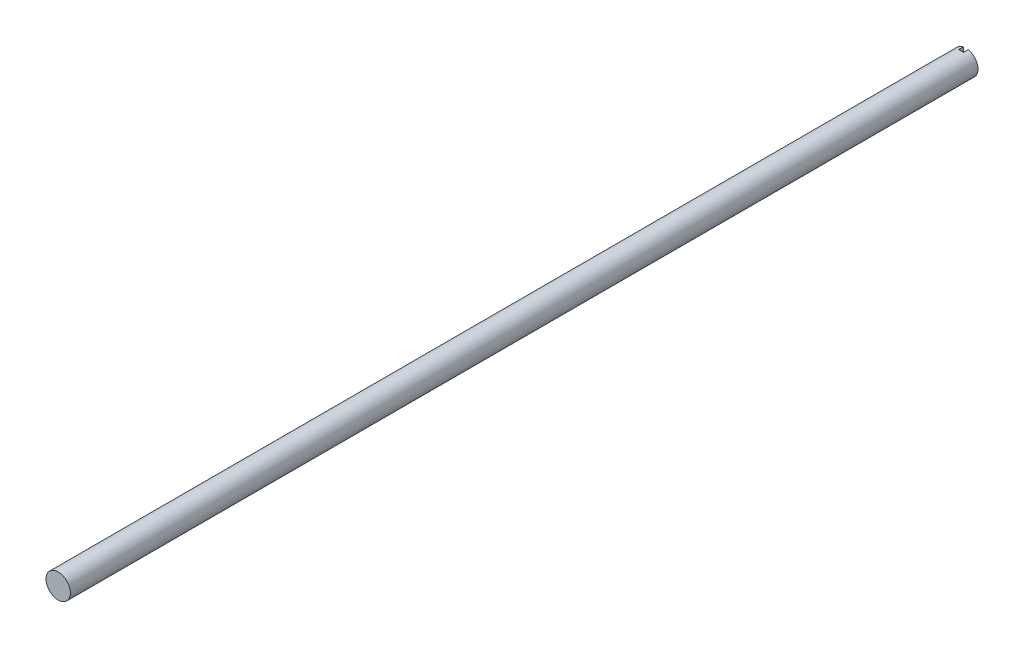
ISO-10303-21;
HEADER;
FILE_DESCRIPTION(('STEP AP214'),'2;1');
FILE_NAME('part.step','',(''),(''),'','','');
FILE_SCHEMA(('AUTOMOTIVE_DESIGN { 1 0 10303 214 1 1 1 1 }'));
ENDSEC;
DATA;
#1=APPLICATION_CONTEXT('core data for automotive mechanical design processes');
#2=APPLICATION_PROTOCOL_DEFINITION('international standard','automotive_design',2000,#1);
#3=PRODUCT_CONTEXT('',#1,'mechanical');
#4=PRODUCT('Part','Part','',(#3));
#5=PRODUCT_RELATED_PRODUCT_CATEGORY('part','',(#4));
#6=PRODUCT_DEFINITION_FORMATION('','',#4);
#7=PRODUCT_DEFINITION_CONTEXT('part definition',#1,'design');
#8=PRODUCT_DEFINITION('design','',#6,#7);
#9=PRODUCT_DEFINITION_SHAPE('','',#8);
#10=(LENGTH_UNIT() NAMED_UNIT(*) SI_UNIT(.MILLI.,.METRE.));
#11=(NAMED_UNIT(*) PLANE_ANGLE_UNIT() SI_UNIT($,.RADIAN.));
#12=(NAMED_UNIT(*) SI_UNIT($,.STERADIAN.) SOLID_ANGLE_UNIT());
#13=UNCERTAINTY_MEASURE_WITH_UNIT(LENGTH_MEASURE(1.E-05),#10,'distance_accuracy_value','');
#14=(GEOMETRIC_REPRESENTATION_CONTEXT(3) GLOBAL_UNCERTAINTY_ASSIGNED_CONTEXT((#13)) GLOBAL_UNIT_ASSIGNED_CONTEXT((#10,
#11,#12)) REPRESENTATION_CONTEXT('',''));
#15=CARTESIAN_POINT('',(0.,0.,0.));
#16=DIRECTION('',(0.,0.,1.));
#17=DIRECTION('',(1.,0.,0.));
#18=AXIS2_PLACEMENT_3D('',#15,#16,#17);
#19=CARTESIAN_POINT('',(0.,0.,0.));
#20=DIRECTION('',(0.,0.,1.));
#21=DIRECTION('',(1.,0.,0.));
#22=AXIS2_PLACEMENT_3D('',#19,#20,#21);
#23=PLANE('',#22);
#24=CARTESIAN_POINT('',(0.,0.,0.));
#25=DIRECTION('',(0.,0.,1.));
#26=DIRECTION('',(1.,0.,0.));
#27=AXIS2_PLACEMENT_3D('',#24,#25,#26);
#28=CIRCLE('',#27,2.5);
#29=CARTESIAN_POINT('',(-0.499999999999999,2.44948974278318,0.));
#30=VERTEX_POINT('',#29);
#31=CARTESIAN_POINT('',(-0.5,-2.44948974278318,0.));
#32=VERTEX_POINT('',#31);
#33=EDGE_CURVE('E44',#30,#32,#28,.T.);
#34=ORIENTED_EDGE('',*,*,#33,.F.);
#35=DIRECTION('',(0.,1.,0.));
#36=VECTOR('',#35,1.);
#37=CARTESIAN_POINT('',(-0.499999999999999,2.44948974278318,0.));
#38=LINE('',#37,#36);
#39=EDGE_CURVE('E74',#32,#30,#38,.T.);
#40=ORIENTED_EDGE('',*,*,#39,.F.);
#41=EDGE_LOOP('',(#34,#40));
#42=FACE_BOUND('',#41,.T.);
#43=ADVANCED_FACE('F35',(#42),#23,.F.);
#44=CARTESIAN_POINT('',(0.,0.,186.));
#45=DIRECTION('',(0.,0.,-1.));
#46=DIRECTION('',(-1.,0.,0.));
#47=AXIS2_PLACEMENT_3D('',#44,#45,#46);
#48=CYLINDRICAL_SURFACE('',#47,2.5);
#49=CARTESIAN_POINT('',(0.,0.,1.));
#50=DIRECTION('',(0.,0.,-1.));
#51=DIRECTION('',(-1.,0.,0.));
#52=AXIS2_PLACEMENT_3D('',#49,#50,#51);
#53=CIRCLE('',#52,2.5);
#54=CARTESIAN_POINT('',(-0.499999999999999,2.44948974278318,1.));
#55=VERTEX_POINT('',#54);
#56=CARTESIAN_POINT('',(0.499999999999999,2.44948974278318,1.));
#57=VERTEX_POINT('',#56);
#58=EDGE_CURVE('E94',#55,#57,#53,.T.);
#59=ORIENTED_EDGE('',*,*,#58,.F.);
#60=DIRECTION('',(0.,0.,-1.));
#61=VECTOR('',#60,1.);
#62=CARTESIAN_POINT('',(-0.499999999999999,2.44948974278318,1.));
#63=LINE('',#62,#61);
#64=EDGE_CURVE('E60',#55,#30,#63,.T.);
#65=ORIENTED_EDGE('',*,*,#64,.T.);
#66=ORIENTED_EDGE('',*,*,#33,.T.);
#67=DIRECTION('',(0.,0.,-1.));
#68=VECTOR('',#67,1.);
#69=CARTESIAN_POINT('',(-0.5,-2.44948974278318,1.));
#70=LINE('',#69,#68);
#71=CARTESIAN_POINT('',(-0.5,-2.44948974278318,1.));
#72=VERTEX_POINT('',#71);
#73=EDGE_CURVE('E88',#72,#32,#70,.T.);
#74=ORIENTED_EDGE('',*,*,#73,.F.);
#75=CARTESIAN_POINT('',(0.,0.,1.));
#76=DIRECTION('',(0.,0.,-1.));
#77=DIRECTION('',(-1.,0.,0.));
#78=AXIS2_PLACEMENT_3D('',#75,#76,#77);
#79=CIRCLE('',#78,2.5);
#80=CARTESIAN_POINT('',(0.499999999999999,-2.44948974278318,1.));
#81=VERTEX_POINT('',#80);
#82=EDGE_CURVE('E92',#81,#72,#79,.T.);
#83=ORIENTED_EDGE('',*,*,#82,.F.);
#84=DIRECTION('',(0.,0.,-1.));
#85=VECTOR('',#84,1.);
#86=CARTESIAN_POINT('',(0.499999999999999,-2.44948974278318,1.));
#87=LINE('',#86,#85);
#88=CARTESIAN_POINT('',(0.499999999999999,-2.44948974278318,0.));
#89=VERTEX_POINT('',#88);
#90=EDGE_CURVE('E81',#81,#89,#87,.T.);
#91=ORIENTED_EDGE('',*,*,#90,.T.);
#92=CARTESIAN_POINT('',(0.499999999999999,2.44948974278318,0.));
#93=VERTEX_POINT('',#92);
#94=EDGE_CURVE('E39',#89,#93,#28,.T.);
#95=ORIENTED_EDGE('',*,*,#94,.T.);
#96=DIRECTION('',(0.,0.,-1.));
#97=VECTOR('',#96,1.);
#98=CARTESIAN_POINT('',(0.499999999999999,2.44948974278318,1.));
#99=LINE('',#98,#97);
#100=EDGE_CURVE('E51',#57,#93,#99,.T.);
#101=ORIENTED_EDGE('',*,*,#100,.F.);
#102=EDGE_LOOP('',(#59,#65,#66,#74,#83,#91,#95,#101));
#103=FACE_BOUND('',#102,.T.);
#104=CARTESIAN_POINT('',(0.,0.,186.));
#105=DIRECTION('',(0.,0.,1.));
#106=DIRECTION('',(1.,0.,0.));
#107=AXIS2_PLACEMENT_3D('',#104,#105,#106);
#108=CIRCLE('',#107,2.5);
#109=CARTESIAN_POINT('',(2.5,0.,186.));
#110=VERTEX_POINT('',#109);
#111=EDGE_CURVE('E11',#110,#110,#108,.T.);
#112=ORIENTED_EDGE('',*,*,#111,.F.);
#113=EDGE_LOOP('',(#112));
#114=FACE_BOUND('',#113,.T.);
#115=ADVANCED_FACE('F37',(#103,#114),#48,.T.);
#116=CARTESIAN_POINT('',(0.,0.,186.));
#117=DIRECTION('',(0.,0.,1.));
#118=DIRECTION('',(1.,0.,0.));
#119=AXIS2_PLACEMENT_3D('',#116,#117,#118);
#120=PLANE('',#119);
#121=ORIENTED_EDGE('',*,*,#111,.T.);
#122=EDGE_LOOP('',(#121));
#123=FACE_BOUND('',#122,.T.);
#124=ADVANCED_FACE('F114',(#123),#120,.T.);
#125=ORIENTED_EDGE('',*,*,#94,.F.);
#126=DIRECTION('',(0.,-1.,0.));
#127=VECTOR('',#126,1.);
#128=CARTESIAN_POINT('',(0.499999999999999,2.44948974278318,0.));
#129=LINE('',#128,#127);
#130=EDGE_CURVE('E83',#93,#89,#129,.T.);
#131=ORIENTED_EDGE('',*,*,#130,.F.);
#132=EDGE_LOOP('',(#125,#131));
#133=FACE_BOUND('',#132,.T.);
#134=ADVANCED_FACE('F112',(#133),#23,.F.);
#135=CARTESIAN_POINT('',(-0.499999999999999,2.44948974278318,1.));
#136=DIRECTION('',(-1.,0.,0.));
#137=DIRECTION('',(0.,0.,1.));
#138=AXIS2_PLACEMENT_3D('',#135,#136,#137);
#139=PLANE('',#138);
#140=ORIENTED_EDGE('',*,*,#39,.T.);
#141=ORIENTED_EDGE('',*,*,#64,.F.);
#142=DIRECTION('',(0.,1.,0.));
#143=VECTOR('',#142,1.);
#144=CARTESIAN_POINT('',(-0.499999999999999,2.44948974278318,1.));
#145=LINE('',#144,#143);
#146=EDGE_CURVE('E99',#72,#55,#145,.T.);
#147=ORIENTED_EDGE('',*,*,#146,.F.);
#148=ORIENTED_EDGE('',*,*,#73,.T.);
#149=EDGE_LOOP('',(#140,#141,#147,#148));
#150=FACE_BOUND('',#149,.T.);
#151=ADVANCED_FACE('F108',(#150),#139,.F.);
#152=CARTESIAN_POINT('',(0.499999999999999,2.44948974278318,1.));
#153=DIRECTION('',(1.,0.,0.));
#154=DIRECTION('',(0.,0.,-1.));
#155=AXIS2_PLACEMENT_3D('',#152,#153,#154);
#156=PLANE('',#155);
#157=ORIENTED_EDGE('',*,*,#130,.T.);
#158=ORIENTED_EDGE('',*,*,#90,.F.);
#159=DIRECTION('',(0.,-1.,0.));
#160=VECTOR('',#159,1.);
#161=CARTESIAN_POINT('',(0.499999999999999,2.44948974278318,1.));
#162=LINE('',#161,#160);
#163=EDGE_CURVE('E78',#57,#81,#162,.T.);
#164=ORIENTED_EDGE('',*,*,#163,.F.);
#165=ORIENTED_EDGE('',*,*,#100,.T.);
#166=EDGE_LOOP('',(#157,#158,#164,#165));
#167=FACE_BOUND('',#166,.T.);
#168=ADVANCED_FACE('F82',(#167),#156,.F.);
#169=CARTESIAN_POINT('',(0.,0.,1.));
#170=DIRECTION('',(0.,0.,-1.));
#171=DIRECTION('',(-1.,0.,0.));
#172=AXIS2_PLACEMENT_3D('',#169,#170,#171);
#173=PLANE('',#172);
#174=ORIENTED_EDGE('',*,*,#58,.T.);
#175=ORIENTED_EDGE('',*,*,#163,.T.);
#176=ORIENTED_EDGE('',*,*,#82,.T.);
#177=ORIENTED_EDGE('',*,*,#146,.T.);
#178=EDGE_LOOP('',(#174,#175,#176,#177));
#179=FACE_BOUND('',#178,.T.);
#180=ADVANCED_FACE('F91',(#179),#173,.T.);
#181=CLOSED_SHELL('',(#43,#115,#124,#134,#151,#168,#180));
#182=MANIFOLD_SOLID_BREP('B2',#181);
#183=ADVANCED_BREP_SHAPE_REPRESENTATION('',(#18,#182),#14);
#184=SHAPE_DEFINITION_REPRESENTATION(#9,#183);
ENDSEC;
END-ISO-10303-21;
